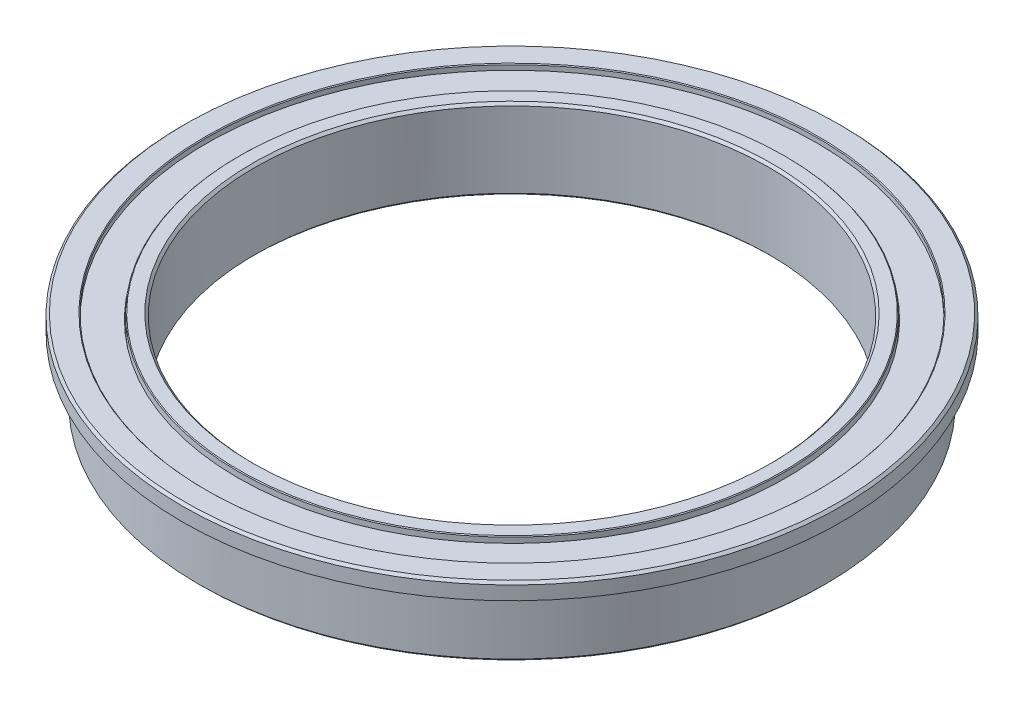
ISO-10303-21;
HEADER;
FILE_DESCRIPTION(('STEP AP214'),'2;1');
FILE_NAME('part.step','',(''),(''),'','','');
FILE_SCHEMA(('AUTOMOTIVE_DESIGN { 1 0 10303 214 1 1 1 1 }'));
ENDSEC;
DATA;
#1=APPLICATION_CONTEXT('core data for automotive mechanical design processes');
#2=APPLICATION_PROTOCOL_DEFINITION('international standard','automotive_design',2000,#1);
#3=PRODUCT_CONTEXT('',#1,'mechanical');
#4=PRODUCT('Part','Part','',(#3));
#5=PRODUCT_RELATED_PRODUCT_CATEGORY('part','',(#4));
#6=PRODUCT_DEFINITION_FORMATION('','',#4);
#7=PRODUCT_DEFINITION_CONTEXT('part definition',#1,'design');
#8=PRODUCT_DEFINITION('design','',#6,#7);
#9=PRODUCT_DEFINITION_SHAPE('','',#8);
#10=(LENGTH_UNIT() NAMED_UNIT(*) SI_UNIT(.MILLI.,.METRE.));
#11=(NAMED_UNIT(*) PLANE_ANGLE_UNIT() SI_UNIT($,.RADIAN.));
#12=(NAMED_UNIT(*) SI_UNIT($,.STERADIAN.) SOLID_ANGLE_UNIT());
#13=UNCERTAINTY_MEASURE_WITH_UNIT(LENGTH_MEASURE(1.E-05),#10,'distance_accuracy_value','');
#14=(GEOMETRIC_REPRESENTATION_CONTEXT(3) GLOBAL_UNCERTAINTY_ASSIGNED_CONTEXT((#13)) GLOBAL_UNIT_ASSIGNED_CONTEXT((#10,
#11,#12)) REPRESENTATION_CONTEXT('',''));
#15=CARTESIAN_POINT('',(0.,0.,0.));
#16=DIRECTION('',(0.,0.,1.));
#17=DIRECTION('',(1.,0.,0.));
#18=AXIS2_PLACEMENT_3D('',#15,#16,#17);
#19=CARTESIAN_POINT('',(0.,0.,0.));
#20=DIRECTION('',(0.,1.,0.));
#21=DIRECTION('',(0.,0.,1.));
#22=AXIS2_PLACEMENT_3D('',#19,#20,#21);
#23=CYLINDRICAL_SURFACE('',#22,19.4);
#24=CARTESIAN_POINT('',(0.,1.5,0.));
#25=DIRECTION('',(0.,1.,0.));
#26=DIRECTION('',(0.,0.,1.));
#27=AXIS2_PLACEMENT_3D('',#24,#25,#26);
#28=CIRCLE('',#27,19.4);
#29=CARTESIAN_POINT('',(0.,1.5,19.4));
#30=VERTEX_POINT('',#29);
#31=EDGE_CURVE('E100',#30,#30,#28,.F.);
#32=ORIENTED_EDGE('',*,*,#31,.T.);
#33=EDGE_LOOP('',(#32));
#34=FACE_BOUND('',#33,.T.);
#35=CARTESIAN_POINT('',(0.,0.95,0.));
#36=DIRECTION('',(0.,1.,0.));
#37=DIRECTION('',(0.,0.,1.));
#38=AXIS2_PLACEMENT_3D('',#35,#36,#37);
#39=CIRCLE('',#38,19.4);
#40=CARTESIAN_POINT('',(0.,0.95,19.4));
#41=VERTEX_POINT('',#40);
#42=EDGE_CURVE('E18',#41,#41,#39,.F.);
#43=ORIENTED_EDGE('',*,*,#42,.F.);
#44=EDGE_LOOP('',(#43));
#45=FACE_BOUND('',#44,.T.);
#46=ADVANCED_FACE('F15',(#34,#45),#23,.T.);
#47=CARTESIAN_POINT('',(19.5,0.95,0.));
#48=DIRECTION('',(0.,1.,0.));
#49=DIRECTION('',(0.,0.,1.));
#50=AXIS2_PLACEMENT_3D('',#47,#48,#49);
#51=PLANE('',#50);
#52=ORIENTED_EDGE('',*,*,#42,.T.);
#53=EDGE_LOOP('',(#52));
#54=FACE_BOUND('',#53,.T.);
#55=CARTESIAN_POINT('',(0.,0.95,0.));
#56=DIRECTION('',(0.,-1.,0.));
#57=DIRECTION('',(0.,0.,-1.));
#58=AXIS2_PLACEMENT_3D('',#55,#56,#57);
#59=CIRCLE('',#58,19.5);
#60=CARTESIAN_POINT('',(0.,0.95,-19.5));
#61=VERTEX_POINT('',#60);
#62=EDGE_CURVE('E98',#61,#61,#59,.T.);
#63=ORIENTED_EDGE('',*,*,#62,.F.);
#64=EDGE_LOOP('',(#63));
#65=FACE_BOUND('',#64,.T.);
#66=ADVANCED_FACE('F107',(#54,#65),#51,.T.);
#67=CARTESIAN_POINT('',(0.,1.5,0.));
#68=DIRECTION('',(0.,1.,0.));
#69=DIRECTION('',(0.,0.,1.));
#70=AXIS2_PLACEMENT_3D('',#67,#68,#69);
#71=PLANE('',#70);
#72=ORIENTED_EDGE('',*,*,#31,.F.);
#73=EDGE_LOOP('',(#72));
#74=FACE_BOUND('',#73,.T.);
#75=CARTESIAN_POINT('',(0.,1.5,0.));
#76=DIRECTION('',(0.,1.,0.));
#77=DIRECTION('',(0.,0.,1.));
#78=AXIS2_PLACEMENT_3D('',#75,#76,#77);
#79=CIRCLE('',#78,20.5);
#80=CARTESIAN_POINT('',(0.,1.5,20.5));
#81=VERTEX_POINT('',#80);
#82=EDGE_CURVE('E53',#81,#81,#79,.T.);
#83=ORIENTED_EDGE('',*,*,#82,.F.);
#84=EDGE_LOOP('',(#83));
#85=FACE_BOUND('',#84,.T.);
#86=ADVANCED_FACE('F114',(#74,#85),#71,.F.);
#87=CARTESIAN_POINT('',(0.,2.5,0.));
#88=DIRECTION('',(0.,-1.,0.));
#89=DIRECTION('',(0.,0.,-1.));
#90=AXIS2_PLACEMENT_3D('',#87,#88,#89);
#91=CYLINDRICAL_SURFACE('',#90,19.5);
#92=ORIENTED_EDGE('',*,*,#62,.T.);
#93=EDGE_LOOP('',(#92));
#94=FACE_BOUND('',#93,.T.);
#95=CARTESIAN_POINT('',(0.,-2.35,0.));
#96=DIRECTION('',(0.,1.,0.));
#97=DIRECTION('',(0.,0.,1.));
#98=AXIS2_PLACEMENT_3D('',#95,#96,#97);
#99=CIRCLE('',#98,19.5);
#100=CARTESIAN_POINT('',(0.,-2.35000000000001,19.5));
#101=VERTEX_POINT('',#100);
#102=EDGE_CURVE('E50',#101,#101,#99,.F.);
#103=ORIENTED_EDGE('',*,*,#102,.F.);
#104=EDGE_LOOP('',(#103));
#105=FACE_BOUND('',#104,.T.);
#106=ADVANCED_FACE('F213',(#94,#105),#91,.T.);
#107=CARTESIAN_POINT('',(0.,1.5,0.));
#108=DIRECTION('',(0.,1.,0.));
#109=DIRECTION('',(0.,0.,1.));
#110=AXIS2_PLACEMENT_3D('',#107,#108,#109);
#111=CYLINDRICAL_SURFACE('',#110,20.5);
#112=CARTESIAN_POINT('',(0.,2.35,0.));
#113=DIRECTION('',(0.,-1.,0.));
#114=DIRECTION('',(0.,0.,-1.));
#115=AXIS2_PLACEMENT_3D('',#112,#113,#114);
#116=CIRCLE('',#115,20.5);
#117=CARTESIAN_POINT('',(0.,2.35,-20.5));
#118=VERTEX_POINT('',#117);
#119=EDGE_CURVE('E46',#118,#118,#116,.F.);
#120=ORIENTED_EDGE('',*,*,#119,.F.);
#121=EDGE_LOOP('',(#120));
#122=FACE_BOUND('',#121,.T.);
#123=ORIENTED_EDGE('',*,*,#82,.T.);
#124=EDGE_LOOP('',(#123));
#125=FACE_BOUND('',#124,.T.);
#126=ADVANCED_FACE('F209',(#122,#125),#111,.T.);
#127=CARTESIAN_POINT('',(0.,-2.35000000000001,0.));
#128=DIRECTION('',(0.,1.,0.));
#129=DIRECTION('',(0.,0.,1.));
#130=AXIS2_PLACEMENT_3D('',#127,#128,#129);
#131=CONICAL_SURFACE('',#130,19.5,0.785398163397444);
#132=CARTESIAN_POINT('',(0.,-2.5,0.));
#133=DIRECTION('',(0.,1.,0.));
#134=DIRECTION('',(0.,0.,1.));
#135=AXIS2_PLACEMENT_3D('',#132,#133,#134);
#136=CIRCLE('',#135,19.35);
#137=CARTESIAN_POINT('',(0.,-2.5,19.35));
#138=VERTEX_POINT('',#137);
#139=EDGE_CURVE('E49',#138,#138,#136,.T.);
#140=ORIENTED_EDGE('',*,*,#139,.T.);
#141=EDGE_LOOP('',(#140));
#142=FACE_BOUND('',#141,.T.);
#143=ORIENTED_EDGE('',*,*,#102,.T.);
#144=EDGE_LOOP('',(#143));
#145=FACE_BOUND('',#144,.T.);
#146=ADVANCED_FACE('F205',(#142,#145),#131,.T.);
#147=CARTESIAN_POINT('',(0.,2.35,0.));
#148=DIRECTION('',(0.,-1.,0.));
#149=DIRECTION('',(0.,0.,-1.));
#150=AXIS2_PLACEMENT_3D('',#147,#148,#149);
#151=CONICAL_SURFACE('',#150,20.5,0.785398163397427);
#152=ORIENTED_EDGE('',*,*,#119,.T.);
#153=EDGE_LOOP('',(#152));
#154=FACE_BOUND('',#153,.T.);
#155=CARTESIAN_POINT('',(0.,2.5,0.));
#156=DIRECTION('',(0.,-1.,0.));
#157=DIRECTION('',(0.,0.,-1.));
#158=AXIS2_PLACEMENT_3D('',#155,#156,#157);
#159=CIRCLE('',#158,20.35);
#160=CARTESIAN_POINT('',(0.,2.5,-20.35));
#161=VERTEX_POINT('',#160);
#162=EDGE_CURVE('E91',#161,#161,#159,.F.);
#163=ORIENTED_EDGE('',*,*,#162,.F.);
#164=EDGE_LOOP('',(#163));
#165=FACE_BOUND('',#164,.T.);
#166=ADVANCED_FACE('F201',(#154,#165),#151,.T.);
#167=CARTESIAN_POINT('',(0.,-2.5,0.));
#168=DIRECTION('',(0.,1.,0.));
#169=DIRECTION('',(0.,0.,1.));
#170=AXIS2_PLACEMENT_3D('',#167,#168,#169);
#171=PLANE('',#170);
#172=ORIENTED_EDGE('',*,*,#139,.F.);
#173=EDGE_LOOP('',(#172));
#174=FACE_BOUND('',#173,.T.);
#175=CARTESIAN_POINT('',(0.,-2.5,0.));
#176=DIRECTION('',(0.,-1.,0.));
#177=DIRECTION('',(0.,0.,-1.));
#178=AXIS2_PLACEMENT_3D('',#175,#176,#177);
#179=CIRCLE('',#178,19.05);
#180=CARTESIAN_POINT('',(0.,-2.5,-19.05));
#181=VERTEX_POINT('',#180);
#182=EDGE_CURVE('E88',#181,#181,#179,.F.);
#183=ORIENTED_EDGE('',*,*,#182,.T.);
#184=EDGE_LOOP('',(#183));
#185=FACE_BOUND('',#184,.T.);
#186=ADVANCED_FACE('F197',(#174,#185),#171,.F.);
#187=CARTESIAN_POINT('',(0.,2.5,0.));
#188=DIRECTION('',(0.,1.,0.));
#189=DIRECTION('',(0.,0.,1.));
#190=AXIS2_PLACEMENT_3D('',#187,#188,#189);
#191=PLANE('',#190);
#192=ORIENTED_EDGE('',*,*,#162,.T.);
#193=EDGE_LOOP('',(#192));
#194=FACE_BOUND('',#193,.T.);
#195=CARTESIAN_POINT('',(0.,2.5,0.));
#196=DIRECTION('',(0.,1.,0.));
#197=DIRECTION('',(-1.,0.,0.));
#198=AXIS2_PLACEMENT_3D('',#195,#196,#197);
#199=CIRCLE('',#198,19.05);
#200=CARTESIAN_POINT('',(-19.05,2.5,0.));
#201=VERTEX_POINT('',#200);
#202=EDGE_CURVE('E45',#201,#201,#199,.F.);
#203=ORIENTED_EDGE('',*,*,#202,.T.);
#204=EDGE_LOOP('',(#203));
#205=FACE_BOUND('',#204,.T.);
#206=ADVANCED_FACE('F193',(#194,#205),#191,.T.);
#207=CARTESIAN_POINT('',(0.,-2.5,0.));
#208=DIRECTION('',(0.,-1.,0.));
#209=DIRECTION('',(0.,0.,-1.));
#210=AXIS2_PLACEMENT_3D('',#207,#208,#209);
#211=CONICAL_SURFACE('',#210,19.05,0.785398163397414);
#212=CARTESIAN_POINT('',(0.,-2.45,0.));
#213=DIRECTION('',(0.,-1.,0.));
#214=DIRECTION('',(0.,0.,-1.));
#215=AXIS2_PLACEMENT_3D('',#212,#213,#214);
#216=CIRCLE('',#215,19.);
#217=CARTESIAN_POINT('',(0.,-2.45,-19.));
#218=VERTEX_POINT('',#217);
#219=EDGE_CURVE('E42',#218,#218,#216,.F.);
#220=ORIENTED_EDGE('',*,*,#219,.T.);
#221=EDGE_LOOP('',(#220));
#222=FACE_BOUND('',#221,.T.);
#223=ORIENTED_EDGE('',*,*,#182,.F.);
#224=EDGE_LOOP('',(#223));
#225=FACE_BOUND('',#224,.T.);
#226=ADVANCED_FACE('F189',(#222,#225),#211,.F.);
#227=CARTESIAN_POINT('',(0.,2.5,0.));
#228=DIRECTION('',(0.,1.,0.));
#229=DIRECTION('',(-1.,0.,0.));
#230=AXIS2_PLACEMENT_3D('',#227,#228,#229);
#231=CONICAL_SURFACE('',#230,19.05,0.785398163397487);
#232=ORIENTED_EDGE('',*,*,#202,.F.);
#233=EDGE_LOOP('',(#232));
#234=FACE_BOUND('',#233,.T.);
#235=CARTESIAN_POINT('',(0.,2.45,0.));
#236=DIRECTION('',(0.,1.,0.));
#237=DIRECTION('',(0.,0.,1.));
#238=AXIS2_PLACEMENT_3D('',#235,#236,#237);
#239=CIRCLE('',#238,19.);
#240=CARTESIAN_POINT('',(0.,2.45,19.));
#241=VERTEX_POINT('',#240);
#242=EDGE_CURVE('E38',#241,#241,#239,.F.);
#243=ORIENTED_EDGE('',*,*,#242,.T.);
#244=EDGE_LOOP('',(#243));
#245=FACE_BOUND('',#244,.T.);
#246=ADVANCED_FACE('F185',(#234,#245),#231,.F.);
#247=CARTESIAN_POINT('',(0.,-2.15,0.));
#248=DIRECTION('',(0.,-1.,0.));
#249=DIRECTION('',(0.,0.,-1.));
#250=AXIS2_PLACEMENT_3D('',#247,#248,#249);
#251=CYLINDRICAL_SURFACE('',#250,19.);
#252=CARTESIAN_POINT('',(0.,-2.15,0.));
#253=DIRECTION('',(0.,-1.,0.));
#254=DIRECTION('',(0.,0.,-1.));
#255=AXIS2_PLACEMENT_3D('',#252,#253,#254);
#256=CIRCLE('',#255,19.);
#257=CARTESIAN_POINT('',(0.,-2.15,-19.));
#258=VERTEX_POINT('',#257);
#259=EDGE_CURVE('E41',#258,#258,#256,.T.);
#260=ORIENTED_EDGE('',*,*,#259,.F.);
#261=EDGE_LOOP('',(#260));
#262=FACE_BOUND('',#261,.T.);
#263=ORIENTED_EDGE('',*,*,#219,.F.);
#264=EDGE_LOOP('',(#263));
#265=FACE_BOUND('',#264,.T.);
#266=ADVANCED_FACE('F181',(#262,#265),#251,.F.);
#267=CARTESIAN_POINT('',(0.,2.15,0.));
#268=DIRECTION('',(0.,1.,0.));
#269=DIRECTION('',(0.,0.,1.));
#270=AXIS2_PLACEMENT_3D('',#267,#268,#269);
#271=CYLINDRICAL_SURFACE('',#270,19.);
#272=ORIENTED_EDGE('',*,*,#242,.F.);
#273=EDGE_LOOP('',(#272));
#274=FACE_BOUND('',#273,.T.);
#275=CARTESIAN_POINT('',(0.,2.15,0.));
#276=DIRECTION('',(0.,1.,0.));
#277=DIRECTION('',(0.,0.,1.));
#278=AXIS2_PLACEMENT_3D('',#275,#276,#277);
#279=CIRCLE('',#278,19.);
#280=CARTESIAN_POINT('',(0.,2.15,19.));
#281=VERTEX_POINT('',#280);
#282=EDGE_CURVE('E81',#281,#281,#279,.T.);
#283=ORIENTED_EDGE('',*,*,#282,.F.);
#284=EDGE_LOOP('',(#283));
#285=FACE_BOUND('',#284,.T.);
#286=ADVANCED_FACE('F177',(#274,#285),#271,.F.);
#287=CARTESIAN_POINT('',(0.,-2.15,0.));
#288=DIRECTION('',(0.,-1.,0.));
#289=DIRECTION('',(0.,0.,-1.));
#290=AXIS2_PLACEMENT_3D('',#287,#288,#289);
#291=PLANE('',#290);
#292=CARTESIAN_POINT('',(0.,-2.15,0.));
#293=DIRECTION('',(0.,-1.,0.));
#294=DIRECTION('',(0.,0.,-1.));
#295=AXIS2_PLACEMENT_3D('',#292,#293,#294);
#296=CIRCLE('',#295,17.05);
#297=CARTESIAN_POINT('',(0.,-2.15,-17.05));
#298=VERTEX_POINT('',#297);
#299=EDGE_CURVE('E78',#298,#298,#296,.F.);
#300=ORIENTED_EDGE('',*,*,#299,.T.);
#301=EDGE_LOOP('',(#300));
#302=FACE_BOUND('',#301,.T.);
#303=ORIENTED_EDGE('',*,*,#259,.T.);
#304=EDGE_LOOP('',(#303));
#305=FACE_BOUND('',#304,.T.);
#306=ADVANCED_FACE('F173',(#302,#305),#291,.T.);
#307=CARTESIAN_POINT('',(0.,2.15,0.));
#308=DIRECTION('',(0.,1.,0.));
#309=DIRECTION('',(0.,0.,1.));
#310=AXIS2_PLACEMENT_3D('',#307,#308,#309);
#311=PLANE('',#310);
#312=ORIENTED_EDGE('',*,*,#282,.T.);
#313=EDGE_LOOP('',(#312));
#314=FACE_BOUND('',#313,.T.);
#315=CARTESIAN_POINT('',(0.,2.15,0.));
#316=DIRECTION('',(0.,1.,0.));
#317=DIRECTION('',(0.,0.,1.));
#318=AXIS2_PLACEMENT_3D('',#315,#316,#317);
#319=CIRCLE('',#318,17.05);
#320=CARTESIAN_POINT('',(0.,2.15,17.05));
#321=VERTEX_POINT('',#320);
#322=EDGE_CURVE('E75',#321,#321,#319,.F.);
#323=ORIENTED_EDGE('',*,*,#322,.T.);
#324=EDGE_LOOP('',(#323));
#325=FACE_BOUND('',#324,.T.);
#326=ADVANCED_FACE('F169',(#314,#325),#311,.T.);
#327=CARTESIAN_POINT('',(0.,-1.8,0.));
#328=DIRECTION('',(0.,-1.,0.));
#329=DIRECTION('',(0.,0.,-1.));
#330=AXIS2_PLACEMENT_3D('',#327,#328,#329);
#331=CYLINDRICAL_SURFACE('',#330,17.05);
#332=CARTESIAN_POINT('',(0.,-1.8,0.));
#333=DIRECTION('',(0.,-1.,0.));
#334=DIRECTION('',(0.,0.,-1.));
#335=AXIS2_PLACEMENT_3D('',#332,#333,#334);
#336=CIRCLE('',#335,17.05);
#337=CARTESIAN_POINT('',(0.,-1.8,-17.05));
#338=VERTEX_POINT('',#337);
#339=EDGE_CURVE('E72',#338,#338,#336,.T.);
#340=ORIENTED_EDGE('',*,*,#339,.F.);
#341=EDGE_LOOP('',(#340));
#342=FACE_BOUND('',#341,.T.);
#343=ORIENTED_EDGE('',*,*,#299,.F.);
#344=EDGE_LOOP('',(#343));
#345=FACE_BOUND('',#344,.T.);
#346=ADVANCED_FACE('F165',(#342,#345),#331,.F.);
#347=CARTESIAN_POINT('',(0.,1.8,0.));
#348=DIRECTION('',(0.,1.,0.));
#349=DIRECTION('',(0.,0.,1.));
#350=AXIS2_PLACEMENT_3D('',#347,#348,#349);
#351=CYLINDRICAL_SURFACE('',#350,17.05);
#352=ORIENTED_EDGE('',*,*,#322,.F.);
#353=EDGE_LOOP('',(#352));
#354=FACE_BOUND('',#353,.T.);
#355=CARTESIAN_POINT('',(0.,1.8,0.));
#356=DIRECTION('',(0.,1.,0.));
#357=DIRECTION('',(0.,0.,1.));
#358=AXIS2_PLACEMENT_3D('',#355,#356,#357);
#359=CIRCLE('',#358,17.05);
#360=CARTESIAN_POINT('',(0.,1.8,17.05));
#361=VERTEX_POINT('',#360);
#362=EDGE_CURVE('E69',#361,#361,#359,.T.);
#363=ORIENTED_EDGE('',*,*,#362,.F.);
#364=EDGE_LOOP('',(#363));
#365=FACE_BOUND('',#364,.T.);
#366=ADVANCED_FACE('F161',(#354,#365),#351,.F.);
#367=CARTESIAN_POINT('',(0.,-1.8,0.));
#368=DIRECTION('',(0.,-1.,0.));
#369=DIRECTION('',(0.,0.,-1.));
#370=AXIS2_PLACEMENT_3D('',#367,#368,#369);
#371=PLANE('',#370);
#372=CARTESIAN_POINT('',(0.,-1.8,0.));
#373=DIRECTION('',(0.,-1.,0.));
#374=DIRECTION('',(0.,0.,-1.));
#375=AXIS2_PLACEMENT_3D('',#372,#373,#374);
#376=CIRCLE('',#375,17.);
#377=CARTESIAN_POINT('',(0.,-1.8,-17.));
#378=VERTEX_POINT('',#377);
#379=EDGE_CURVE('E66',#378,#378,#376,.T.);
#380=ORIENTED_EDGE('',*,*,#379,.F.);
#381=EDGE_LOOP('',(#380));
#382=FACE_BOUND('',#381,.T.);
#383=ORIENTED_EDGE('',*,*,#339,.T.);
#384=EDGE_LOOP('',(#383));
#385=FACE_BOUND('',#384,.T.);
#386=ADVANCED_FACE('F157',(#382,#385),#371,.T.);
#387=CARTESIAN_POINT('',(0.,1.8,0.));
#388=DIRECTION('',(0.,1.,0.));
#389=DIRECTION('',(0.,0.,1.));
#390=AXIS2_PLACEMENT_3D('',#387,#388,#389);
#391=PLANE('',#390);
#392=ORIENTED_EDGE('',*,*,#362,.T.);
#393=EDGE_LOOP('',(#392));
#394=FACE_BOUND('',#393,.T.);
#395=CARTESIAN_POINT('',(0.,1.8,0.));
#396=DIRECTION('',(0.,1.,0.));
#397=DIRECTION('',(0.,0.,1.));
#398=AXIS2_PLACEMENT_3D('',#395,#396,#397);
#399=CIRCLE('',#398,17.);
#400=CARTESIAN_POINT('',(0.,1.8,17.));
#401=VERTEX_POINT('',#400);
#402=EDGE_CURVE('E37',#401,#401,#399,.T.);
#403=ORIENTED_EDGE('',*,*,#402,.F.);
#404=EDGE_LOOP('',(#403));
#405=FACE_BOUND('',#404,.T.);
#406=ADVANCED_FACE('F153',(#394,#405),#391,.T.);
#407=CARTESIAN_POINT('',(0.,-2.15,0.));
#408=DIRECTION('',(0.,-1.,0.));
#409=DIRECTION('',(0.,0.,-1.));
#410=AXIS2_PLACEMENT_3D('',#407,#408,#409);
#411=CYLINDRICAL_SURFACE('',#410,17.);
#412=ORIENTED_EDGE('',*,*,#379,.T.);
#413=EDGE_LOOP('',(#412));
#414=FACE_BOUND('',#413,.T.);
#415=CARTESIAN_POINT('',(0.,-2.45,0.));
#416=DIRECTION('',(0.,1.,0.));
#417=DIRECTION('',(0.,0.,1.));
#418=AXIS2_PLACEMENT_3D('',#415,#416,#417);
#419=CIRCLE('',#418,17.);
#420=CARTESIAN_POINT('',(0.,-2.45000000000001,17.));
#421=VERTEX_POINT('',#420);
#422=EDGE_CURVE('E34',#421,#421,#419,.F.);
#423=ORIENTED_EDGE('',*,*,#422,.F.);
#424=EDGE_LOOP('',(#423));
#425=FACE_BOUND('',#424,.T.);
#426=ADVANCED_FACE('F149',(#414,#425),#411,.T.);
#427=CARTESIAN_POINT('',(0.,2.15,0.));
#428=DIRECTION('',(0.,1.,0.));
#429=DIRECTION('',(0.,0.,1.));
#430=AXIS2_PLACEMENT_3D('',#427,#428,#429);
#431=CYLINDRICAL_SURFACE('',#430,17.);
#432=CARTESIAN_POINT('',(0.,2.45000000000002,0.));
#433=DIRECTION('',(0.,-1.,0.));
#434=DIRECTION('',(0.,0.,-1.));
#435=AXIS2_PLACEMENT_3D('',#432,#433,#434);
#436=CIRCLE('',#435,17.);
#437=CARTESIAN_POINT('',(0.,2.45000000000002,-17.));
#438=VERTEX_POINT('',#437);
#439=EDGE_CURVE('E30',#438,#438,#436,.F.);
#440=ORIENTED_EDGE('',*,*,#439,.F.);
#441=EDGE_LOOP('',(#440));
#442=FACE_BOUND('',#441,.T.);
#443=ORIENTED_EDGE('',*,*,#402,.T.);
#444=EDGE_LOOP('',(#443));
#445=FACE_BOUND('',#444,.T.);
#446=ADVANCED_FACE('F145',(#442,#445),#431,.T.);
#447=CARTESIAN_POINT('',(0.,-2.45000000000001,0.));
#448=DIRECTION('',(0.,1.,0.));
#449=DIRECTION('',(-1.,0.,0.));
#450=AXIS2_PLACEMENT_3D('',#447,#448,#449);
#451=CONICAL_SURFACE('',#450,17.,0.785398163397483);
#452=CARTESIAN_POINT('',(0.,-2.5,0.));
#453=DIRECTION('',(0.,1.,0.));
#454=DIRECTION('',(-1.,0.,0.));
#455=AXIS2_PLACEMENT_3D('',#452,#453,#454);
#456=CIRCLE('',#455,16.95);
#457=CARTESIAN_POINT('',(-16.95,-2.5,0.));
#458=VERTEX_POINT('',#457);
#459=EDGE_CURVE('E33',#458,#458,#456,.T.);
#460=ORIENTED_EDGE('',*,*,#459,.T.);
#461=EDGE_LOOP('',(#460));
#462=FACE_BOUND('',#461,.T.);
#463=ORIENTED_EDGE('',*,*,#422,.T.);
#464=EDGE_LOOP('',(#463));
#465=FACE_BOUND('',#464,.T.);
#466=ADVANCED_FACE('F141',(#462,#465),#451,.T.);
#467=CARTESIAN_POINT('',(0.,2.45000000000002,0.));
#468=DIRECTION('',(0.,-1.,0.));
#469=DIRECTION('',(0.,0.,-1.));
#470=AXIS2_PLACEMENT_3D('',#467,#468,#469);
#471=CONICAL_SURFACE('',#470,17.,0.785398163397414);
#472=ORIENTED_EDGE('',*,*,#439,.T.);
#473=EDGE_LOOP('',(#472));
#474=FACE_BOUND('',#473,.T.);
#475=CARTESIAN_POINT('',(0.,2.5,0.));
#476=DIRECTION('',(0.,-1.,0.));
#477=DIRECTION('',(0.,0.,-1.));
#478=AXIS2_PLACEMENT_3D('',#475,#476,#477);
#479=CIRCLE('',#478,16.95);
#480=CARTESIAN_POINT('',(0.,2.5,-16.95));
#481=VERTEX_POINT('',#480);
#482=EDGE_CURVE('E59',#481,#481,#479,.F.);
#483=ORIENTED_EDGE('',*,*,#482,.F.);
#484=EDGE_LOOP('',(#483));
#485=FACE_BOUND('',#484,.T.);
#486=ADVANCED_FACE('F137',(#474,#485),#471,.T.);
#487=CARTESIAN_POINT('',(0.,-2.5,0.));
#488=DIRECTION('',(0.,1.,0.));
#489=DIRECTION('',(0.,0.,1.));
#490=AXIS2_PLACEMENT_3D('',#487,#488,#489);
#491=PLANE('',#490);
#492=CARTESIAN_POINT('',(0.,-2.5,0.));
#493=DIRECTION('',(0.,-1.,0.));
#494=DIRECTION('',(0.,0.,-1.));
#495=AXIS2_PLACEMENT_3D('',#492,#493,#494);
#496=CIRCLE('',#495,16.15);
#497=CARTESIAN_POINT('',(0.,-2.5,-16.15));
#498=VERTEX_POINT('',#497);
#499=EDGE_CURVE('E56',#498,#498,#496,.F.);
#500=ORIENTED_EDGE('',*,*,#499,.T.);
#501=EDGE_LOOP('',(#500));
#502=FACE_BOUND('',#501,.T.);
#503=ORIENTED_EDGE('',*,*,#459,.F.);
#504=EDGE_LOOP('',(#503));
#505=FACE_BOUND('',#504,.T.);
#506=ADVANCED_FACE('F133',(#502,#505),#491,.F.);
#507=CARTESIAN_POINT('',(0.,2.5,0.));
#508=DIRECTION('',(0.,1.,0.));
#509=DIRECTION('',(0.,0.,1.));
#510=AXIS2_PLACEMENT_3D('',#507,#508,#509);
#511=PLANE('',#510);
#512=CARTESIAN_POINT('',(0.,2.5,0.));
#513=DIRECTION('',(0.,1.,0.));
#514=DIRECTION('',(0.,0.,1.));
#515=AXIS2_PLACEMENT_3D('',#512,#513,#514);
#516=CIRCLE('',#515,16.15);
#517=CARTESIAN_POINT('',(0.,2.5,16.15));
#518=VERTEX_POINT('',#517);
#519=EDGE_CURVE('E27',#518,#518,#516,.F.);
#520=ORIENTED_EDGE('',*,*,#519,.T.);
#521=EDGE_LOOP('',(#520));
#522=FACE_BOUND('',#521,.T.);
#523=ORIENTED_EDGE('',*,*,#482,.T.);
#524=EDGE_LOOP('',(#523));
#525=FACE_BOUND('',#524,.T.);
#526=ADVANCED_FACE('F129',(#522,#525),#511,.T.);
#527=CARTESIAN_POINT('',(0.,-2.5,0.));
#528=DIRECTION('',(0.,-1.,0.));
#529=DIRECTION('',(0.,0.,-1.));
#530=AXIS2_PLACEMENT_3D('',#527,#528,#529);
#531=CONICAL_SURFACE('',#530,16.15,0.785398163397437);
#532=CARTESIAN_POINT('',(0.,-2.35,0.));
#533=DIRECTION('',(0.,-1.,0.));
#534=DIRECTION('',(0.,0.,-1.));
#535=AXIS2_PLACEMENT_3D('',#532,#533,#534);
#536=CIRCLE('',#535,16.);
#537=CARTESIAN_POINT('',(0.,-2.35,-16.));
#538=VERTEX_POINT('',#537);
#539=EDGE_CURVE('E22',#538,#538,#536,.F.);
#540=ORIENTED_EDGE('',*,*,#539,.T.);
#541=EDGE_LOOP('',(#540));
#542=FACE_BOUND('',#541,.T.);
#543=ORIENTED_EDGE('',*,*,#499,.F.);
#544=EDGE_LOOP('',(#543));
#545=FACE_BOUND('',#544,.T.);
#546=ADVANCED_FACE('F123',(#542,#545),#531,.F.);
#547=CARTESIAN_POINT('',(0.,2.5,0.));
#548=DIRECTION('',(0.,1.,0.));
#549=DIRECTION('',(0.,0.,1.));
#550=AXIS2_PLACEMENT_3D('',#547,#548,#549);
#551=CONICAL_SURFACE('',#550,16.15,0.785398163397447);
#552=CARTESIAN_POINT('',(0.,2.35,0.));
#553=DIRECTION('',(0.,-1.,0.));
#554=DIRECTION('',(0.,0.,-1.));
#555=AXIS2_PLACEMENT_3D('',#552,#553,#554);
#556=CIRCLE('',#555,16.);
#557=CARTESIAN_POINT('',(0.,2.35,-16.));
#558=VERTEX_POINT('',#557);
#559=EDGE_CURVE('E9',#558,#558,#556,.T.);
#560=ORIENTED_EDGE('',*,*,#559,.T.);
#561=EDGE_LOOP('',(#560));
#562=FACE_BOUND('',#561,.T.);
#563=ORIENTED_EDGE('',*,*,#519,.F.);
#564=EDGE_LOOP('',(#563));
#565=FACE_BOUND('',#564,.T.);
#566=ADVANCED_FACE('F117',(#562,#565),#551,.F.);
#567=CARTESIAN_POINT('',(0.,2.5,0.));
#568=DIRECTION('',(0.,-1.,0.));
#569=DIRECTION('',(0.,0.,-1.));
#570=AXIS2_PLACEMENT_3D('',#567,#568,#569);
#571=CYLINDRICAL_SURFACE('',#570,16.);
#572=ORIENTED_EDGE('',*,*,#559,.F.);
#573=EDGE_LOOP('',(#572));
#574=FACE_BOUND('',#573,.T.);
#575=ORIENTED_EDGE('',*,*,#539,.F.);
#576=EDGE_LOOP('',(#575));
#577=FACE_BOUND('',#576,.T.);
#578=ADVANCED_FACE('F115',(#574,#577),#571,.F.);
#579=CLOSED_SHELL('',(#46,#66,#86,#106,#126,#146,#166,#186,#206,#226,#246,#266,#286,#306,#326,
#346,#366,#386,#406,#426,#446,#466,#486,#506,#526,#546,#566,#578));
#580=MANIFOLD_SOLID_BREP('B1',#579);
#581=ADVANCED_BREP_SHAPE_REPRESENTATION('',(#18,#580),#14);
#582=SHAPE_DEFINITION_REPRESENTATION(#9,#581);
ENDSEC;
END-ISO-10303-21;
